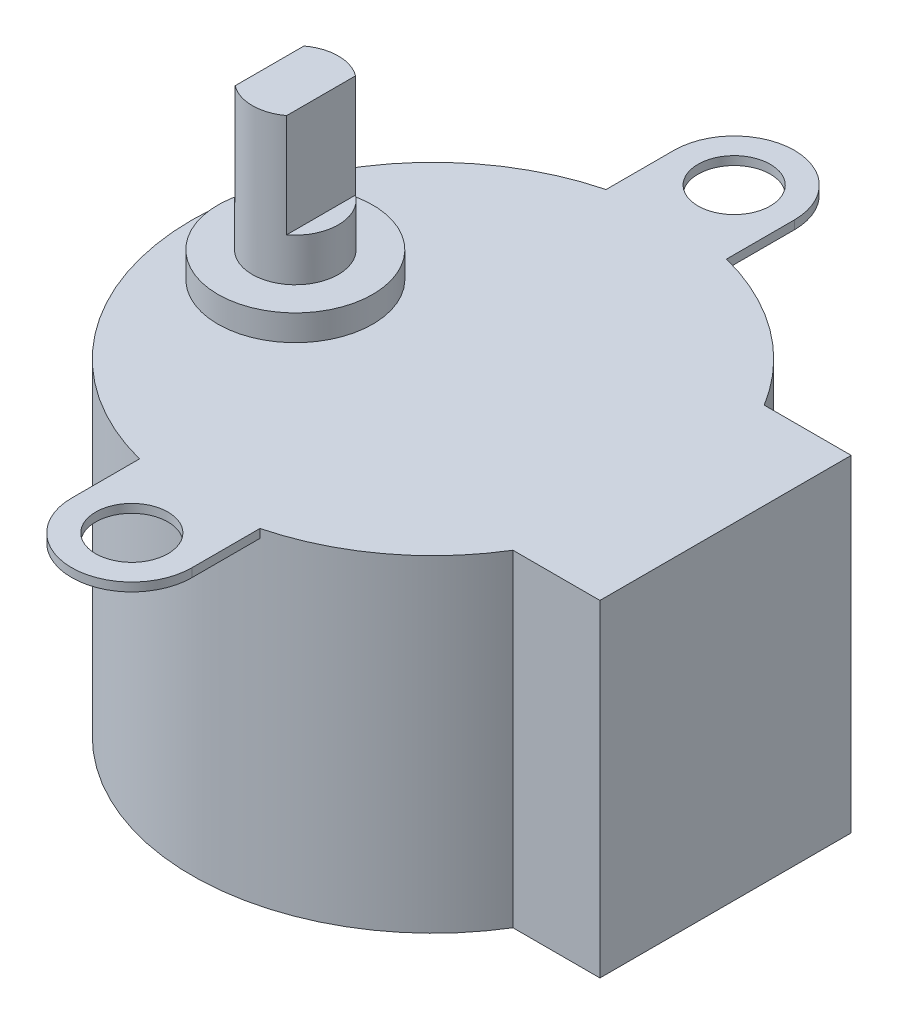
ISO-10303-21;
HEADER;
FILE_DESCRIPTION(('STEP AP214'),'2;1');
FILE_NAME('part.step','',(''),(''),'','','');
FILE_SCHEMA(('AUTOMOTIVE_DESIGN { 1 0 10303 214 1 1 1 1 }'));
ENDSEC;
DATA;
#1=APPLICATION_CONTEXT('core data for automotive mechanical design processes');
#2=APPLICATION_PROTOCOL_DEFINITION('international standard','automotive_design',2000,#1);
#3=PRODUCT_CONTEXT('',#1,'mechanical');
#4=PRODUCT('Part','Part','',(#3));
#5=PRODUCT_RELATED_PRODUCT_CATEGORY('part','',(#4));
#6=PRODUCT_DEFINITION_FORMATION('','',#4);
#7=PRODUCT_DEFINITION_CONTEXT('part definition',#1,'design');
#8=PRODUCT_DEFINITION('design','',#6,#7);
#9=PRODUCT_DEFINITION_SHAPE('','',#8);
#10=(LENGTH_UNIT() NAMED_UNIT(*) SI_UNIT(.MILLI.,.METRE.));
#11=(NAMED_UNIT(*) PLANE_ANGLE_UNIT() SI_UNIT($,.RADIAN.));
#12=(NAMED_UNIT(*) SI_UNIT($,.STERADIAN.) SOLID_ANGLE_UNIT());
#13=UNCERTAINTY_MEASURE_WITH_UNIT(LENGTH_MEASURE(1.E-05),#10,'distance_accuracy_value','');
#14=(GEOMETRIC_REPRESENTATION_CONTEXT(3) GLOBAL_UNCERTAINTY_ASSIGNED_CONTEXT((#13)) GLOBAL_UNIT_ASSIGNED_CONTEXT((#10,
#11,#12)) REPRESENTATION_CONTEXT('',''));
#15=CARTESIAN_POINT('',(0.,0.,0.));
#16=DIRECTION('',(0.,0.,1.));
#17=DIRECTION('',(1.,0.,0.));
#18=AXIS2_PLACEMENT_3D('',#15,#16,#17);
#19=CARTESIAN_POINT('',(-8.,20.5,0.));
#20=DIRECTION('',(0.,1.,0.));
#21=DIRECTION('',(0.,0.,1.));
#22=AXIS2_PLACEMENT_3D('',#19,#20,#21);
#23=PLANE('',#22);
#24=CARTESIAN_POINT('',(-8.,20.5,0.));
#25=DIRECTION('',(0.,1.,0.));
#26=DIRECTION('',(0.,0.,1.));
#27=AXIS2_PLACEMENT_3D('',#24,#25,#26);
#28=CIRCLE('',#27,4.5);
#29=CARTESIAN_POINT('',(-8.,20.5,4.5));
#30=VERTEX_POINT('',#29);
#31=EDGE_CURVE('E184',#30,#30,#28,.T.);
#32=ORIENTED_EDGE('',*,*,#31,.T.);
#33=EDGE_LOOP('',(#32));
#34=FACE_BOUND('',#33,.T.);
#35=CARTESIAN_POINT('',(-8.,20.5,0.));
#36=DIRECTION('',(0.,1.,0.));
#37=DIRECTION('',(0.,0.,1.));
#38=AXIS2_PLACEMENT_3D('',#35,#36,#37);
#39=CIRCLE('',#38,2.5);
#40=CARTESIAN_POINT('',(-8.,20.5,2.5));
#41=VERTEX_POINT('',#40);
#42=EDGE_CURVE('E176',#41,#41,#39,.T.);
#43=ORIENTED_EDGE('',*,*,#42,.F.);
#44=EDGE_LOOP('',(#43));
#45=FACE_BOUND('',#44,.T.);
#46=ADVANCED_FACE('F33',(#34,#45),#23,.T.);
#47=CARTESIAN_POINT('',(0.,19.,0.));
#48=DIRECTION('',(0.,1.,0.));
#49=DIRECTION('',(0.,0.,1.));
#50=AXIS2_PLACEMENT_3D('',#47,#48,#49);
#51=PLANE('',#50);
#52=CARTESIAN_POINT('',(0.,19.,-17.5));
#53=DIRECTION('',(0.,1.,0.));
#54=DIRECTION('',(0.,0.,1.));
#55=AXIS2_PLACEMENT_3D('',#52,#53,#54);
#56=CIRCLE('',#55,2.1);
#57=CARTESIAN_POINT('',(0.,19.,-15.4));
#58=VERTEX_POINT('',#57);
#59=EDGE_CURVE('E187',#58,#58,#56,.T.);
#60=ORIENTED_EDGE('',*,*,#59,.F.);
#61=EDGE_LOOP('',(#60));
#62=FACE_BOUND('',#61,.T.);
#63=CARTESIAN_POINT('',(0.,19.,17.5));
#64=DIRECTION('',(0.,1.,0.));
#65=DIRECTION('',(0.,0.,1.));
#66=AXIS2_PLACEMENT_3D('',#63,#64,#65);
#67=CIRCLE('',#66,2.1);
#68=CARTESIAN_POINT('',(0.,19.,19.6));
#69=VERTEX_POINT('',#68);
#70=EDGE_CURVE('E193',#69,#69,#67,.T.);
#71=ORIENTED_EDGE('',*,*,#70,.F.);
#72=EDGE_LOOP('',(#71));
#73=FACE_BOUND('',#72,.T.);
#74=CARTESIAN_POINT('',(0.,19.,0.));
#75=DIRECTION('',(0.,1.,0.));
#76=DIRECTION('',(0.,0.,1.));
#77=AXIS2_PLACEMENT_3D('',#74,#75,#76);
#78=CIRCLE('',#77,14.);
#79=CARTESIAN_POINT('',(-3.5,19.,-13.555441711726));
#80=VERTEX_POINT('',#79);
#81=CARTESIAN_POINT('',(-3.5,19.,13.555441711726));
#82=VERTEX_POINT('',#81);
#83=EDGE_CURVE('E261',#80,#82,#78,.T.);
#84=ORIENTED_EDGE('',*,*,#83,.T.);
#85=DIRECTION('',(0.,0.,1.));
#86=VECTOR('',#85,1.);
#87=CARTESIAN_POINT('',(-3.50000000000001,19.,-17.5));
#88=LINE('',#87,#86);
#89=CARTESIAN_POINT('',(-3.49999999999999,19.,17.5));
#90=VERTEX_POINT('',#89);
#91=EDGE_CURVE('E220',#82,#90,#88,.T.);
#92=ORIENTED_EDGE('',*,*,#91,.T.);
#93=CARTESIAN_POINT('',(0.,19.,17.5));
#94=DIRECTION('',(0.,1.,0.));
#95=DIRECTION('',(0.,0.,1.));
#96=AXIS2_PLACEMENT_3D('',#93,#94,#95);
#97=CIRCLE('',#96,3.5);
#98=CARTESIAN_POINT('',(3.5,19.,17.5));
#99=VERTEX_POINT('',#98);
#100=EDGE_CURVE('E223',#90,#99,#97,.T.);
#101=ORIENTED_EDGE('',*,*,#100,.T.);
#102=DIRECTION('',(0.,0.,-1.));
#103=VECTOR('',#102,1.);
#104=CARTESIAN_POINT('',(3.49999999999999,19.,-17.5));
#105=LINE('',#104,#103);
#106=CARTESIAN_POINT('',(3.5,19.,13.555441711726));
#107=VERTEX_POINT('',#106);
#108=EDGE_CURVE('E206',#99,#107,#105,.T.);
#109=ORIENTED_EDGE('',*,*,#108,.T.);
#110=CARTESIAN_POINT('',(11.9461290801665,19.,7.3));
#111=VERTEX_POINT('',#110);
#112=EDGE_CURVE('E256',#107,#111,#78,.T.);
#113=ORIENTED_EDGE('',*,*,#112,.T.);
#114=DIRECTION('',(1.,0.,0.));
#115=VECTOR('',#114,1.);
#116=CARTESIAN_POINT('',(11.9461290801665,19.,7.3));
#117=LINE('',#116,#115);
#118=CARTESIAN_POINT('',(17.,19.,7.3));
#119=VERTEX_POINT('',#118);
#120=EDGE_CURVE('E260',#111,#119,#117,.T.);
#121=ORIENTED_EDGE('',*,*,#120,.T.);
#122=DIRECTION('',(0.,0.,-1.));
#123=VECTOR('',#122,1.);
#124=CARTESIAN_POINT('',(17.,19.,-7.3));
#125=LINE('',#124,#123);
#126=CARTESIAN_POINT('',(17.,19.,-7.3));
#127=VERTEX_POINT('',#126);
#128=EDGE_CURVE('E250',#119,#127,#125,.T.);
#129=ORIENTED_EDGE('',*,*,#128,.T.);
#130=DIRECTION('',(-1.,0.,0.));
#131=VECTOR('',#130,1.);
#132=CARTESIAN_POINT('',(11.9461290801665,19.,-7.3));
#133=LINE('',#132,#131);
#134=CARTESIAN_POINT('',(11.9461290801665,19.,-7.3));
#135=VERTEX_POINT('',#134);
#136=EDGE_CURVE('E253',#127,#135,#133,.T.);
#137=ORIENTED_EDGE('',*,*,#136,.T.);
#138=CARTESIAN_POINT('',(3.49999999999999,19.,-13.555441711726));
#139=VERTEX_POINT('',#138);
#140=EDGE_CURVE('E257',#135,#139,#78,.T.);
#141=ORIENTED_EDGE('',*,*,#140,.T.);
#142=CARTESIAN_POINT('',(3.49999999999999,19.,-17.5));
#143=VERTEX_POINT('',#142);
#144=EDGE_CURVE('E226',#139,#143,#105,.T.);
#145=ORIENTED_EDGE('',*,*,#144,.T.);
#146=CARTESIAN_POINT('',(0.,19.,-17.5));
#147=DIRECTION('',(0.,1.,0.));
#148=DIRECTION('',(0.,0.,1.));
#149=AXIS2_PLACEMENT_3D('',#146,#147,#148);
#150=CIRCLE('',#149,3.5);
#151=CARTESIAN_POINT('',(-3.50000000000001,19.,-17.5));
#152=VERTEX_POINT('',#151);
#153=EDGE_CURVE('E199',#143,#152,#150,.T.);
#154=ORIENTED_EDGE('',*,*,#153,.T.);
#155=EDGE_CURVE('E221',#152,#80,#88,.T.);
#156=ORIENTED_EDGE('',*,*,#155,.T.);
#157=EDGE_LOOP('',(#84,#92,#101,#109,#113,#121,#129,#137,#141,#145,#154,#156));
#158=FACE_BOUND('',#157,.T.);
#159=CARTESIAN_POINT('',(-8.,19.,0.));
#160=DIRECTION('',(0.,1.,0.));
#161=DIRECTION('',(0.,0.,1.));
#162=AXIS2_PLACEMENT_3D('',#159,#160,#161);
#163=CIRCLE('',#162,4.5);
#164=CARTESIAN_POINT('',(-8.,19.,4.5));
#165=VERTEX_POINT('',#164);
#166=EDGE_CURVE('E181',#165,#165,#163,.T.);
#167=ORIENTED_EDGE('',*,*,#166,.F.);
#168=EDGE_LOOP('',(#167));
#169=FACE_BOUND('',#168,.T.);
#170=ADVANCED_FACE('F301',(#62,#73,#158,#169),#51,.T.);
#171=CARTESIAN_POINT('',(17.,19.,-7.3));
#172=DIRECTION('',(-1.,0.,0.));
#173=DIRECTION('',(0.,0.,1.));
#174=AXIS2_PLACEMENT_3D('',#171,#172,#173);
#175=PLANE('',#174);
#176=DIRECTION('',(0.,0.,-1.));
#177=VECTOR('',#176,1.);
#178=CARTESIAN_POINT('',(17.,0.,-7.3));
#179=LINE('',#178,#177);
#180=CARTESIAN_POINT('',(17.,0.,7.3));
#181=VERTEX_POINT('',#180);
#182=CARTESIAN_POINT('',(17.,0.,-7.3));
#183=VERTEX_POINT('',#182);
#184=EDGE_CURVE('E249',#181,#183,#179,.T.);
#185=ORIENTED_EDGE('',*,*,#184,.T.);
#186=DIRECTION('',(0.,-1.,0.));
#187=VECTOR('',#186,1.);
#188=CARTESIAN_POINT('',(17.,19.,-7.3));
#189=LINE('',#188,#187);
#190=EDGE_CURVE('E278',#127,#183,#189,.T.);
#191=ORIENTED_EDGE('',*,*,#190,.F.);
#192=ORIENTED_EDGE('',*,*,#128,.F.);
#193=DIRECTION('',(0.,-1.,0.));
#194=VECTOR('',#193,1.);
#195=CARTESIAN_POINT('',(17.,19.,7.3));
#196=LINE('',#195,#194);
#197=EDGE_CURVE('E263',#119,#181,#196,.T.);
#198=ORIENTED_EDGE('',*,*,#197,.T.);
#199=EDGE_LOOP('',(#185,#191,#192,#198));
#200=FACE_BOUND('',#199,.T.);
#201=ADVANCED_FACE('F35',(#200),#175,.F.);
#202=CARTESIAN_POINT('',(11.9461290801665,19.,-7.3));
#203=DIRECTION('',(0.,0.,1.));
#204=DIRECTION('',(1.,0.,0.));
#205=AXIS2_PLACEMENT_3D('',#202,#203,#204);
#206=PLANE('',#205);
#207=DIRECTION('',(-1.,0.,0.));
#208=VECTOR('',#207,1.);
#209=CARTESIAN_POINT('',(11.9461290801665,0.,-7.3));
#210=LINE('',#209,#208);
#211=CARTESIAN_POINT('',(11.9461290801665,0.,-7.3));
#212=VERTEX_POINT('',#211);
#213=EDGE_CURVE('E266',#183,#212,#210,.T.);
#214=ORIENTED_EDGE('',*,*,#213,.T.);
#215=DIRECTION('',(0.,-1.,0.));
#216=VECTOR('',#215,1.);
#217=CARTESIAN_POINT('',(11.9461290801665,19.,-7.3));
#218=LINE('',#217,#216);
#219=EDGE_CURVE('E276',#135,#212,#218,.T.);
#220=ORIENTED_EDGE('',*,*,#219,.F.);
#221=ORIENTED_EDGE('',*,*,#136,.F.);
#222=ORIENTED_EDGE('',*,*,#190,.T.);
#223=EDGE_LOOP('',(#214,#220,#221,#222));
#224=FACE_BOUND('',#223,.T.);
#225=ADVANCED_FACE('F380',(#224),#206,.F.);
#226=CARTESIAN_POINT('',(0.,19.,0.));
#227=DIRECTION('',(0.,-1.,0.));
#228=DIRECTION('',(0.,0.,-1.));
#229=AXIS2_PLACEMENT_3D('',#226,#227,#228);
#230=CYLINDRICAL_SURFACE('',#229,14.);
#231=CARTESIAN_POINT('',(0.,18.5,0.));
#232=DIRECTION('',(0.,1.,0.));
#233=DIRECTION('',(0.,0.,1.));
#234=AXIS2_PLACEMENT_3D('',#231,#232,#233);
#235=CIRCLE('',#234,14.);
#236=CARTESIAN_POINT('',(3.49999999999999,18.5,-13.555441711726));
#237=VERTEX_POINT('',#236);
#238=CARTESIAN_POINT('',(-3.5,18.5,-13.555441711726));
#239=VERTEX_POINT('',#238);
#240=EDGE_CURVE('E11',#237,#239,#235,.T.);
#241=ORIENTED_EDGE('',*,*,#240,.F.);
#242=DIRECTION('',(0.,-1.,0.));
#243=VECTOR('',#242,1.);
#244=CARTESIAN_POINT('',(3.49999999999999,19.,-13.555441711726));
#245=LINE('',#244,#243);
#246=EDGE_CURVE('E243',#237,#139,#245,.F.);
#247=ORIENTED_EDGE('',*,*,#246,.T.);
#248=ORIENTED_EDGE('',*,*,#140,.F.);
#249=ORIENTED_EDGE('',*,*,#219,.T.);
#250=CARTESIAN_POINT('',(0.,0.,0.));
#251=DIRECTION('',(0.,1.,0.));
#252=DIRECTION('',(0.,0.,1.));
#253=AXIS2_PLACEMENT_3D('',#250,#251,#252);
#254=CIRCLE('',#253,14.);
#255=CARTESIAN_POINT('',(11.9461290801665,0.,7.3));
#256=VERTEX_POINT('',#255);
#257=EDGE_CURVE('E268',#212,#256,#254,.T.);
#258=ORIENTED_EDGE('',*,*,#257,.T.);
#259=DIRECTION('',(0.,-1.,0.));
#260=VECTOR('',#259,1.);
#261=CARTESIAN_POINT('',(11.9461290801665,19.,7.3));
#262=LINE('',#261,#260);
#263=EDGE_CURVE('E273',#111,#256,#262,.T.);
#264=ORIENTED_EDGE('',*,*,#263,.F.);
#265=ORIENTED_EDGE('',*,*,#112,.F.);
#266=DIRECTION('',(0.,-1.,0.));
#267=VECTOR('',#266,1.);
#268=CARTESIAN_POINT('',(3.5,19.,13.555441711726));
#269=LINE('',#268,#267);
#270=CARTESIAN_POINT('',(3.5,18.5,13.555441711726));
#271=VERTEX_POINT('',#270);
#272=EDGE_CURVE('E246',#107,#271,#269,.T.);
#273=ORIENTED_EDGE('',*,*,#272,.T.);
#274=CARTESIAN_POINT('',(-3.5,18.5,13.555441711726));
#275=VERTEX_POINT('',#274);
#276=EDGE_CURVE('E37',#275,#271,#235,.T.);
#277=ORIENTED_EDGE('',*,*,#276,.F.);
#278=DIRECTION('',(0.,-1.,0.));
#279=VECTOR('',#278,1.);
#280=CARTESIAN_POINT('',(-3.5,19.,13.555441711726));
#281=LINE('',#280,#279);
#282=EDGE_CURVE('E231',#275,#82,#281,.F.);
#283=ORIENTED_EDGE('',*,*,#282,.T.);
#284=ORIENTED_EDGE('',*,*,#83,.F.);
#285=DIRECTION('',(0.,-1.,0.));
#286=VECTOR('',#285,1.);
#287=CARTESIAN_POINT('',(-3.5,19.,-13.555441711726));
#288=LINE('',#287,#286);
#289=EDGE_CURVE('E240',#80,#239,#288,.T.);
#290=ORIENTED_EDGE('',*,*,#289,.T.);
#291=EDGE_LOOP('',(#241,#247,#248,#249,#258,#264,#265,#273,#277,#283,#284,#290));
#292=FACE_BOUND('',#291,.T.);
#293=ADVANCED_FACE('F295',(#292),#230,.T.);
#294=CARTESIAN_POINT('',(11.9461290801665,19.,7.3));
#295=DIRECTION('',(0.,0.,-1.));
#296=DIRECTION('',(-1.,0.,0.));
#297=AXIS2_PLACEMENT_3D('',#294,#295,#296);
#298=PLANE('',#297);
#299=DIRECTION('',(1.,0.,0.));
#300=VECTOR('',#299,1.);
#301=CARTESIAN_POINT('',(11.9461290801665,0.,7.3));
#302=LINE('',#301,#300);
#303=EDGE_CURVE('E254',#256,#181,#302,.T.);
#304=ORIENTED_EDGE('',*,*,#303,.T.);
#305=ORIENTED_EDGE('',*,*,#197,.F.);
#306=ORIENTED_EDGE('',*,*,#120,.F.);
#307=ORIENTED_EDGE('',*,*,#263,.T.);
#308=EDGE_LOOP('',(#304,#305,#306,#307));
#309=FACE_BOUND('',#308,.T.);
#310=ADVANCED_FACE('F321',(#309),#298,.F.);
#311=CARTESIAN_POINT('',(0.,0.,0.));
#312=DIRECTION('',(0.,1.,0.));
#313=DIRECTION('',(0.,0.,1.));
#314=AXIS2_PLACEMENT_3D('',#311,#312,#313);
#315=PLANE('',#314);
#316=ORIENTED_EDGE('',*,*,#184,.F.);
#317=ORIENTED_EDGE('',*,*,#303,.F.);
#318=ORIENTED_EDGE('',*,*,#257,.F.);
#319=ORIENTED_EDGE('',*,*,#213,.F.);
#320=EDGE_LOOP('',(#316,#317,#318,#319));
#321=FACE_BOUND('',#320,.T.);
#322=ADVANCED_FACE('F313',(#321),#315,.F.);
#323=CARTESIAN_POINT('',(0.,18.5,17.5));
#324=DIRECTION('',(0.,1.,0.));
#325=DIRECTION('',(0.,0.,1.));
#326=AXIS2_PLACEMENT_3D('',#323,#324,#325);
#327=CYLINDRICAL_SURFACE('',#326,3.5);
#328=ORIENTED_EDGE('',*,*,#100,.F.);
#329=DIRECTION('',(0.,1.,0.));
#330=VECTOR('',#329,1.);
#331=CARTESIAN_POINT('',(-3.49999999999999,18.5,17.5));
#332=LINE('',#331,#330);
#333=CARTESIAN_POINT('',(-3.49999999999999,18.5,17.5));
#334=VERTEX_POINT('',#333);
#335=EDGE_CURVE('E234',#334,#90,#332,.T.);
#336=ORIENTED_EDGE('',*,*,#335,.F.);
#337=CARTESIAN_POINT('',(0.,18.5,17.5));
#338=DIRECTION('',(0.,1.,0.));
#339=DIRECTION('',(0.,0.,1.));
#340=AXIS2_PLACEMENT_3D('',#337,#338,#339);
#341=CIRCLE('',#340,3.5);
#342=CARTESIAN_POINT('',(3.5,18.5,17.5));
#343=VERTEX_POINT('',#342);
#344=EDGE_CURVE('E210',#334,#343,#341,.T.);
#345=ORIENTED_EDGE('',*,*,#344,.T.);
#346=DIRECTION('',(0.,1.,0.));
#347=VECTOR('',#346,1.);
#348=CARTESIAN_POINT('',(3.5,18.5,17.5));
#349=LINE('',#348,#347);
#350=EDGE_CURVE('E232',#343,#99,#349,.T.);
#351=ORIENTED_EDGE('',*,*,#350,.T.);
#352=EDGE_LOOP('',(#328,#336,#345,#351));
#353=FACE_BOUND('',#352,.T.);
#354=ADVANCED_FACE('F310',(#353),#327,.T.);
#355=CARTESIAN_POINT('',(0.,18.5,17.5));
#356=DIRECTION('',(0.,1.,0.));
#357=DIRECTION('',(0.,0.,1.));
#358=AXIS2_PLACEMENT_3D('',#355,#356,#357);
#359=CYLINDRICAL_SURFACE('',#358,2.1);
#360=CARTESIAN_POINT('',(0.,18.5,17.5));
#361=DIRECTION('',(0.,1.,0.));
#362=DIRECTION('',(0.,0.,1.));
#363=AXIS2_PLACEMENT_3D('',#360,#361,#362);
#364=CIRCLE('',#363,2.1);
#365=CARTESIAN_POINT('',(0.,18.5,19.6));
#366=VERTEX_POINT('',#365);
#367=EDGE_CURVE('E196',#366,#366,#364,.T.);
#368=ORIENTED_EDGE('',*,*,#367,.F.);
#369=EDGE_LOOP('',(#368));
#370=FACE_BOUND('',#369,.T.);
#371=ORIENTED_EDGE('',*,*,#70,.T.);
#372=EDGE_LOOP('',(#371));
#373=FACE_BOUND('',#372,.T.);
#374=ADVANCED_FACE('F312',(#370,#373),#359,.F.);
#375=CARTESIAN_POINT('',(0.,18.5,-17.5));
#376=DIRECTION('',(0.,1.,0.));
#377=DIRECTION('',(0.,0.,1.));
#378=AXIS2_PLACEMENT_3D('',#375,#376,#377);
#379=PLANE('',#378);
#380=ORIENTED_EDGE('',*,*,#367,.T.);
#381=EDGE_LOOP('',(#380));
#382=FACE_BOUND('',#381,.T.);
#383=DIRECTION('',(0.,0.,1.));
#384=VECTOR('',#383,1.);
#385=CARTESIAN_POINT('',(-3.50000000000001,18.5,-17.5));
#386=LINE('',#385,#384);
#387=EDGE_CURVE('E205',#275,#334,#386,.T.);
#388=ORIENTED_EDGE('',*,*,#387,.F.);
#389=ORIENTED_EDGE('',*,*,#276,.T.);
#390=DIRECTION('',(0.,0.,-1.));
#391=VECTOR('',#390,1.);
#392=CARTESIAN_POINT('',(3.49999999999999,18.5,-17.5));
#393=LINE('',#392,#391);
#394=EDGE_CURVE('E214',#343,#271,#393,.T.);
#395=ORIENTED_EDGE('',*,*,#394,.F.);
#396=ORIENTED_EDGE('',*,*,#344,.F.);
#397=EDGE_LOOP('',(#388,#389,#395,#396));
#398=FACE_BOUND('',#397,.T.);
#399=ADVANCED_FACE('F286',(#382,#398),#379,.F.);
#400=CARTESIAN_POINT('',(-3.50000000000001,18.5,-17.5));
#401=DIRECTION('',(-1.,0.,0.));
#402=DIRECTION('',(0.,0.,1.));
#403=AXIS2_PLACEMENT_3D('',#400,#401,#402);
#404=PLANE('',#403);
#405=ORIENTED_EDGE('',*,*,#282,.F.);
#406=ORIENTED_EDGE('',*,*,#387,.T.);
#407=ORIENTED_EDGE('',*,*,#335,.T.);
#408=ORIENTED_EDGE('',*,*,#91,.F.);
#409=EDGE_LOOP('',(#405,#406,#407,#408));
#410=FACE_BOUND('',#409,.T.);
#411=ADVANCED_FACE('F306',(#410),#404,.T.);
#412=CARTESIAN_POINT('',(3.49999999999999,18.5,-17.5));
#413=DIRECTION('',(1.,0.,0.));
#414=DIRECTION('',(0.,0.,-1.));
#415=AXIS2_PLACEMENT_3D('',#412,#413,#414);
#416=PLANE('',#415);
#417=ORIENTED_EDGE('',*,*,#272,.F.);
#418=ORIENTED_EDGE('',*,*,#108,.F.);
#419=ORIENTED_EDGE('',*,*,#350,.F.);
#420=ORIENTED_EDGE('',*,*,#394,.T.);
#421=EDGE_LOOP('',(#417,#418,#419,#420));
#422=FACE_BOUND('',#421,.T.);
#423=ADVANCED_FACE('F291',(#422),#416,.T.);
#424=CARTESIAN_POINT('',(0.,18.5,-17.5));
#425=DIRECTION('',(0.,1.,0.));
#426=DIRECTION('',(0.,0.,1.));
#427=AXIS2_PLACEMENT_3D('',#424,#425,#426);
#428=CIRCLE('',#427,2.1);
#429=CARTESIAN_POINT('',(0.,18.5,-15.4));
#430=VERTEX_POINT('',#429);
#431=EDGE_CURVE('E190',#430,#430,#428,.T.);
#432=ORIENTED_EDGE('',*,*,#431,.T.);
#433=EDGE_LOOP('',(#432));
#434=FACE_BOUND('',#433,.T.);
#435=CARTESIAN_POINT('',(3.49999999999999,18.5,-17.5));
#436=VERTEX_POINT('',#435);
#437=EDGE_CURVE('E213',#237,#436,#393,.T.);
#438=ORIENTED_EDGE('',*,*,#437,.F.);
#439=ORIENTED_EDGE('',*,*,#240,.T.);
#440=CARTESIAN_POINT('',(-3.50000000000001,18.5,-17.5));
#441=VERTEX_POINT('',#440);
#442=EDGE_CURVE('E207',#441,#239,#386,.T.);
#443=ORIENTED_EDGE('',*,*,#442,.F.);
#444=CARTESIAN_POINT('',(0.,18.5,-17.5));
#445=DIRECTION('',(0.,1.,0.));
#446=DIRECTION('',(0.,0.,1.));
#447=AXIS2_PLACEMENT_3D('',#444,#445,#446);
#448=CIRCLE('',#447,3.5);
#449=EDGE_CURVE('E202',#436,#441,#448,.T.);
#450=ORIENTED_EDGE('',*,*,#449,.F.);
#451=EDGE_LOOP('',(#438,#439,#443,#450));
#452=FACE_BOUND('',#451,.T.);
#453=ADVANCED_FACE('F348',(#434,#452),#379,.F.);
#454=ORIENTED_EDGE('',*,*,#246,.F.);
#455=ORIENTED_EDGE('',*,*,#437,.T.);
#456=DIRECTION('',(0.,1.,0.));
#457=VECTOR('',#456,1.);
#458=CARTESIAN_POINT('',(3.49999999999999,18.5,-17.5));
#459=LINE('',#458,#457);
#460=EDGE_CURVE('E228',#436,#143,#459,.T.);
#461=ORIENTED_EDGE('',*,*,#460,.T.);
#462=ORIENTED_EDGE('',*,*,#144,.F.);
#463=EDGE_LOOP('',(#454,#455,#461,#462));
#464=FACE_BOUND('',#463,.T.);
#465=ADVANCED_FACE('F350',(#464),#416,.T.);
#466=ORIENTED_EDGE('',*,*,#289,.F.);
#467=ORIENTED_EDGE('',*,*,#155,.F.);
#468=DIRECTION('',(0.,1.,0.));
#469=VECTOR('',#468,1.);
#470=CARTESIAN_POINT('',(-3.50000000000001,18.5,-17.5));
#471=LINE('',#470,#469);
#472=EDGE_CURVE('E217',#441,#152,#471,.T.);
#473=ORIENTED_EDGE('',*,*,#472,.F.);
#474=ORIENTED_EDGE('',*,*,#442,.T.);
#475=EDGE_LOOP('',(#466,#467,#473,#474));
#476=FACE_BOUND('',#475,.T.);
#477=ADVANCED_FACE('F356',(#476),#404,.T.);
#478=CARTESIAN_POINT('',(0.,18.5,-17.5));
#479=DIRECTION('',(0.,1.,0.));
#480=DIRECTION('',(0.,0.,1.));
#481=AXIS2_PLACEMENT_3D('',#478,#479,#480);
#482=CYLINDRICAL_SURFACE('',#481,3.5);
#483=ORIENTED_EDGE('',*,*,#153,.F.);
#484=ORIENTED_EDGE('',*,*,#460,.F.);
#485=ORIENTED_EDGE('',*,*,#449,.T.);
#486=ORIENTED_EDGE('',*,*,#472,.T.);
#487=EDGE_LOOP('',(#483,#484,#485,#486));
#488=FACE_BOUND('',#487,.T.);
#489=ADVANCED_FACE('F345',(#488),#482,.T.);
#490=CARTESIAN_POINT('',(0.,18.5,-17.5));
#491=DIRECTION('',(0.,1.,0.));
#492=DIRECTION('',(0.,0.,1.));
#493=AXIS2_PLACEMENT_3D('',#490,#491,#492);
#494=CYLINDRICAL_SURFACE('',#493,2.1);
#495=ORIENTED_EDGE('',*,*,#431,.F.);
#496=EDGE_LOOP('',(#495));
#497=FACE_BOUND('',#496,.T.);
#498=ORIENTED_EDGE('',*,*,#59,.T.);
#499=EDGE_LOOP('',(#498));
#500=FACE_BOUND('',#499,.T.);
#501=ADVANCED_FACE('F342',(#497,#500),#494,.F.);
#502=CARTESIAN_POINT('',(-8.,20.5,0.));
#503=DIRECTION('',(0.,-1.,0.));
#504=DIRECTION('',(0.,0.,-1.));
#505=AXIS2_PLACEMENT_3D('',#502,#503,#504);
#506=CYLINDRICAL_SURFACE('',#505,4.5);
#507=ORIENTED_EDGE('',*,*,#31,.F.);
#508=EDGE_LOOP('',(#507));
#509=FACE_BOUND('',#508,.T.);
#510=ORIENTED_EDGE('',*,*,#166,.T.);
#511=EDGE_LOOP('',(#510));
#512=FACE_BOUND('',#511,.T.);
#513=ADVANCED_FACE('F340',(#509,#512),#506,.T.);
#514=CARTESIAN_POINT('',(-8.,29.,0.));
#515=DIRECTION('',(0.,-1.,0.));
#516=DIRECTION('',(0.,0.,-1.));
#517=AXIS2_PLACEMENT_3D('',#514,#515,#516);
#518=CYLINDRICAL_SURFACE('',#517,2.5);
#519=CARTESIAN_POINT('',(-8.,29.,0.));
#520=DIRECTION('',(0.,1.,0.));
#521=DIRECTION('',(0.,0.,1.));
#522=AXIS2_PLACEMENT_3D('',#519,#520,#521);
#523=CIRCLE('',#522,2.5);
#524=CARTESIAN_POINT('',(-9.5,29.,2.));
#525=VERTEX_POINT('',#524);
#526=CARTESIAN_POINT('',(-6.5,29.,2.));
#527=VERTEX_POINT('',#526);
#528=EDGE_CURVE('E162',#525,#527,#523,.T.);
#529=ORIENTED_EDGE('',*,*,#528,.F.);
#530=DIRECTION('',(0.,1.,0.));
#531=VECTOR('',#530,1.);
#532=CARTESIAN_POINT('',(-9.5,23.,2.));
#533=LINE('',#532,#531);
#534=CARTESIAN_POINT('',(-9.5,23.,2.));
#535=VERTEX_POINT('',#534);
#536=EDGE_CURVE('E48',#535,#525,#533,.T.);
#537=ORIENTED_EDGE('',*,*,#536,.F.);
#538=CARTESIAN_POINT('',(-8.,23.,0.));
#539=DIRECTION('',(0.,1.,0.));
#540=DIRECTION('',(0.,0.,1.));
#541=AXIS2_PLACEMENT_3D('',#538,#539,#540);
#542=CIRCLE('',#541,2.5);
#543=CARTESIAN_POINT('',(-9.5,23.,-2.));
#544=VERTEX_POINT('',#543);
#545=EDGE_CURVE('E148',#544,#535,#542,.T.);
#546=ORIENTED_EDGE('',*,*,#545,.F.);
#547=DIRECTION('',(0.,1.,0.));
#548=VECTOR('',#547,1.);
#549=CARTESIAN_POINT('',(-9.5,23.,-2.));
#550=LINE('',#549,#548);
#551=CARTESIAN_POINT('',(-9.5,29.,-2.));
#552=VERTEX_POINT('',#551);
#553=EDGE_CURVE('E156',#544,#552,#550,.T.);
#554=ORIENTED_EDGE('',*,*,#553,.T.);
#555=CARTESIAN_POINT('',(-6.5,29.,-2.));
#556=VERTEX_POINT('',#555);
#557=EDGE_CURVE('E178',#556,#552,#523,.T.);
#558=ORIENTED_EDGE('',*,*,#557,.F.);
#559=DIRECTION('',(0.,1.,0.));
#560=VECTOR('',#559,1.);
#561=CARTESIAN_POINT('',(-6.5,23.,-2.));
#562=LINE('',#561,#560);
#563=CARTESIAN_POINT('',(-6.5,23.,-2.));
#564=VERTEX_POINT('',#563);
#565=EDGE_CURVE('E56',#564,#556,#562,.T.);
#566=ORIENTED_EDGE('',*,*,#565,.F.);
#567=CARTESIAN_POINT('',(-8.,23.,0.));
#568=DIRECTION('',(0.,1.,0.));
#569=DIRECTION('',(0.,0.,1.));
#570=AXIS2_PLACEMENT_3D('',#567,#568,#569);
#571=CIRCLE('',#570,2.5);
#572=CARTESIAN_POINT('',(-6.5,23.,2.));
#573=VERTEX_POINT('',#572);
#574=EDGE_CURVE('E168',#573,#564,#571,.T.);
#575=ORIENTED_EDGE('',*,*,#574,.F.);
#576=DIRECTION('',(0.,1.,0.));
#577=VECTOR('',#576,1.);
#578=CARTESIAN_POINT('',(-6.5,23.,2.));
#579=LINE('',#578,#577);
#580=EDGE_CURVE('E174',#573,#527,#579,.T.);
#581=ORIENTED_EDGE('',*,*,#580,.T.);
#582=EDGE_LOOP('',(#529,#537,#546,#554,#558,#566,#575,#581));
#583=FACE_BOUND('',#582,.T.);
#584=ORIENTED_EDGE('',*,*,#42,.T.);
#585=EDGE_LOOP('',(#584));
#586=FACE_BOUND('',#585,.T.);
#587=ADVANCED_FACE('F159',(#583,#586),#518,.T.);
#588=CARTESIAN_POINT('',(-8.,29.,0.));
#589=DIRECTION('',(0.,1.,0.));
#590=DIRECTION('',(0.,0.,1.));
#591=AXIS2_PLACEMENT_3D('',#588,#589,#590);
#592=PLANE('',#591);
#593=DIRECTION('',(0.,0.,-1.));
#594=VECTOR('',#593,1.);
#595=CARTESIAN_POINT('',(-9.5,29.,-2.));
#596=LINE('',#595,#594);
#597=EDGE_CURVE('E153',#525,#552,#596,.T.);
#598=ORIENTED_EDGE('',*,*,#597,.F.);
#599=ORIENTED_EDGE('',*,*,#528,.T.);
#600=DIRECTION('',(0.,0.,1.));
#601=VECTOR('',#600,1.);
#602=CARTESIAN_POINT('',(-6.5,29.,-2.));
#603=LINE('',#602,#601);
#604=EDGE_CURVE('E164',#556,#527,#603,.T.);
#605=ORIENTED_EDGE('',*,*,#604,.F.);
#606=ORIENTED_EDGE('',*,*,#557,.T.);
#607=EDGE_LOOP('',(#598,#599,#605,#606));
#608=FACE_BOUND('',#607,.T.);
#609=ADVANCED_FACE('F501',(#608),#592,.T.);
#610=CARTESIAN_POINT('',(-6.5,23.,-2.));
#611=DIRECTION('',(-1.,0.,0.));
#612=DIRECTION('',(0.,0.,1.));
#613=AXIS2_PLACEMENT_3D('',#610,#611,#612);
#614=PLANE('',#613);
#615=ORIENTED_EDGE('',*,*,#604,.T.);
#616=ORIENTED_EDGE('',*,*,#580,.F.);
#617=DIRECTION('',(0.,0.,1.));
#618=VECTOR('',#617,1.);
#619=CARTESIAN_POINT('',(-6.5,23.,-2.));
#620=LINE('',#619,#618);
#621=EDGE_CURVE('E170',#564,#573,#620,.T.);
#622=ORIENTED_EDGE('',*,*,#621,.F.);
#623=ORIENTED_EDGE('',*,*,#565,.T.);
#624=EDGE_LOOP('',(#615,#616,#622,#623));
#625=FACE_BOUND('',#624,.T.);
#626=ADVANCED_FACE('F508',(#625),#614,.F.);
#627=CARTESIAN_POINT('',(-8.,23.,0.));
#628=DIRECTION('',(0.,1.,0.));
#629=DIRECTION('',(0.,0.,1.));
#630=AXIS2_PLACEMENT_3D('',#627,#628,#629);
#631=PLANE('',#630);
#632=ORIENTED_EDGE('',*,*,#574,.T.);
#633=ORIENTED_EDGE('',*,*,#621,.T.);
#634=EDGE_LOOP('',(#632,#633));
#635=FACE_BOUND('',#634,.T.);
#636=ADVANCED_FACE('F516',(#635),#631,.T.);
#637=CARTESIAN_POINT('',(-9.5,23.,-2.));
#638=DIRECTION('',(1.,0.,0.));
#639=DIRECTION('',(0.,0.,-1.));
#640=AXIS2_PLACEMENT_3D('',#637,#638,#639);
#641=PLANE('',#640);
#642=ORIENTED_EDGE('',*,*,#597,.T.);
#643=ORIENTED_EDGE('',*,*,#553,.F.);
#644=DIRECTION('',(0.,0.,-1.));
#645=VECTOR('',#644,1.);
#646=CARTESIAN_POINT('',(-9.5,23.,-2.));
#647=LINE('',#646,#645);
#648=EDGE_CURVE('E150',#535,#544,#647,.T.);
#649=ORIENTED_EDGE('',*,*,#648,.F.);
#650=ORIENTED_EDGE('',*,*,#536,.T.);
#651=EDGE_LOOP('',(#642,#643,#649,#650));
#652=FACE_BOUND('',#651,.T.);
#653=ADVANCED_FACE('F155',(#652),#641,.F.);
#654=CARTESIAN_POINT('',(-8.,23.,0.));
#655=DIRECTION('',(0.,1.,0.));
#656=DIRECTION('',(0.,0.,1.));
#657=AXIS2_PLACEMENT_3D('',#654,#655,#656);
#658=PLANE('',#657);
#659=ORIENTED_EDGE('',*,*,#545,.T.);
#660=ORIENTED_EDGE('',*,*,#648,.T.);
#661=EDGE_LOOP('',(#659,#660));
#662=FACE_BOUND('',#661,.T.);
#663=ADVANCED_FACE('F149',(#662),#658,.T.);
#664=CLOSED_SHELL('',(#46,#170,#201,#225,#293,#310,#322,#354,#374,#399,#411,#423,#453,#465,#477,
#489,#501,#513,#587,#609,#626,#636,#653,#663));
#665=MANIFOLD_SOLID_BREP('B2',#664);
#666=ADVANCED_BREP_SHAPE_REPRESENTATION('',(#18,#665),#14);
#667=SHAPE_DEFINITION_REPRESENTATION(#9,#666);
ENDSEC;
END-ISO-10303-21;
